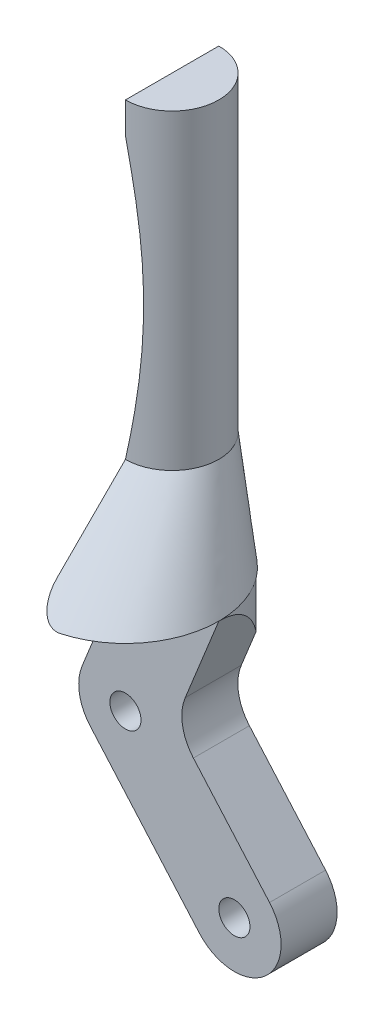
ISO-10303-21;
HEADER;
FILE_DESCRIPTION(('STEP AP214'),'2;1');
FILE_NAME('part.step','',(''),(''),'','','');
FILE_SCHEMA(('AUTOMOTIVE_DESIGN { 1 0 10303 214 1 1 1 1 }'));
ENDSEC;
DATA;
#1=APPLICATION_CONTEXT('core data for automotive mechanical design processes');
#2=APPLICATION_PROTOCOL_DEFINITION('international standard','automotive_design',2000,#1);
#3=PRODUCT_CONTEXT('',#1,'mechanical');
#4=PRODUCT('Part','Part','',(#3));
#5=PRODUCT_RELATED_PRODUCT_CATEGORY('part','',(#4));
#6=PRODUCT_DEFINITION_FORMATION('','',#4);
#7=PRODUCT_DEFINITION_CONTEXT('part definition',#1,'design');
#8=PRODUCT_DEFINITION('design','',#6,#7);
#9=PRODUCT_DEFINITION_SHAPE('','',#8);
#10=(LENGTH_UNIT() NAMED_UNIT(*) SI_UNIT(.MILLI.,.METRE.));
#11=(NAMED_UNIT(*) PLANE_ANGLE_UNIT() SI_UNIT($,.RADIAN.));
#12=(NAMED_UNIT(*) SI_UNIT($,.STERADIAN.) SOLID_ANGLE_UNIT());
#13=UNCERTAINTY_MEASURE_WITH_UNIT(LENGTH_MEASURE(1.E-05),#10,'distance_accuracy_value','');
#14=(GEOMETRIC_REPRESENTATION_CONTEXT(3) GLOBAL_UNCERTAINTY_ASSIGNED_CONTEXT((#13)) GLOBAL_UNIT_ASSIGNED_CONTEXT((#10,
#11,#12)) REPRESENTATION_CONTEXT('',''));
#15=CARTESIAN_POINT('',(0.,0.,0.));
#16=DIRECTION('',(0.,0.,1.));
#17=DIRECTION('',(1.,0.,0.));
#18=AXIS2_PLACEMENT_3D('',#15,#16,#17);
#19=CARTESIAN_POINT('',(0.,0.,0.));
#20=DIRECTION('',(-1.,0.,0.));
#21=DIRECTION('',(0.,0.,1.));
#22=AXIS2_PLACEMENT_3D('',#19,#20,#21);
#23=PLANE('',#22);
#24=DIRECTION('',(0.,0.,1.));
#25=VECTOR('',#24,1.);
#26=CARTESIAN_POINT('',(0.,3.,-3.05));
#27=LINE('',#26,#25);
#28=CARTESIAN_POINT('',(0.,3.,-3.));
#29=VERTEX_POINT('',#28);
#30=CARTESIAN_POINT('',(0.,3.,0.));
#31=VERTEX_POINT('',#30);
#32=EDGE_CURVE('E429',#29,#31,#27,.T.);
#33=ORIENTED_EDGE('',*,*,#32,.F.);
#34=DIRECTION('',(0.,1.,0.));
#35=VECTOR('',#34,1.);
#36=CARTESIAN_POINT('',(0.,1.5,-3.));
#37=LINE('',#36,#35);
#38=CARTESIAN_POINT('',(0.,0.8,-3.));
#39=VERTEX_POINT('',#38);
#40=EDGE_CURVE('E439',#39,#29,#37,.T.);
#41=ORIENTED_EDGE('',*,*,#40,.F.);
#42=DIRECTION('',(0.,0.,1.));
#43=VECTOR('',#42,1.);
#44=CARTESIAN_POINT('',(0.,0.8,-1.8));
#45=LINE('',#44,#43);
#46=CARTESIAN_POINT('',(0.,0.8,-1.8));
#47=VERTEX_POINT('',#46);
#48=EDGE_CURVE('E456',#39,#47,#45,.T.);
#49=ORIENTED_EDGE('',*,*,#48,.T.);
#50=DIRECTION('',(0.,-1.,0.));
#51=VECTOR('',#50,1.);
#52=CARTESIAN_POINT('',(0.,-8.,-1.8));
#53=LINE('',#52,#51);
#54=CARTESIAN_POINT('',(0.,0.,-1.8));
#55=VERTEX_POINT('',#54);
#56=EDGE_CURVE('E314',#47,#55,#53,.T.);
#57=ORIENTED_EDGE('',*,*,#56,.T.);
#58=DIRECTION('',(0.,0.,1.));
#59=VECTOR('',#58,1.);
#60=CARTESIAN_POINT('',(0.,0.,-1.8));
#61=LINE('',#60,#59);
#62=CARTESIAN_POINT('',(0.,0.,0.));
#63=VERTEX_POINT('',#62);
#64=EDGE_CURVE('E491',#55,#63,#61,.T.);
#65=ORIENTED_EDGE('',*,*,#64,.T.);
#66=DIRECTION('',(0.,1.,0.));
#67=VECTOR('',#66,1.);
#68=CARTESIAN_POINT('',(0.,0.,0.));
#69=LINE('',#68,#67);
#70=CARTESIAN_POINT('',(0.,0.8,0.));
#71=VERTEX_POINT('',#70);
#72=EDGE_CURVE('E208',#63,#71,#69,.T.);
#73=ORIENTED_EDGE('',*,*,#72,.T.);
#74=DIRECTION('',(0.,0.,1.));
#75=VECTOR('',#74,1.);
#76=CARTESIAN_POINT('',(0.,0.8,3.));
#77=LINE('',#76,#75);
#78=CARTESIAN_POINT('',(0.,0.8,2.2));
#79=VERTEX_POINT('',#78);
#80=EDGE_CURVE('E298',#71,#79,#77,.T.);
#81=ORIENTED_EDGE('',*,*,#80,.T.);
#82=DIRECTION('',(0.,-0.707106781186548,0.707106781186548));
#83=VECTOR('',#82,1.);
#84=CARTESIAN_POINT('',(0.,1.5,1.5));
#85=LINE('',#84,#83);
#86=EDGE_CURVE('E216',#31,#79,#85,.T.);
#87=ORIENTED_EDGE('',*,*,#86,.F.);
#88=EDGE_LOOP('',(#33,#41,#49,#57,#65,#73,#81,#87));
#89=FACE_BOUND('',#88,.T.);
#90=ADVANCED_FACE('F56',(#89),#23,.T.);
#91=CARTESIAN_POINT('',(0.,0.,0.));
#92=DIRECTION('',(0.,1.,0.));
#93=DIRECTION('',(0.,0.,1.));
#94=AXIS2_PLACEMENT_3D('',#91,#92,#93);
#95=PLANE('',#94);
#96=CARTESIAN_POINT('',(0.,0.,0.));
#97=DIRECTION('',(0.,1.,0.));
#98=DIRECTION('',(0.,0.,1.));
#99=AXIS2_PLACEMENT_3D('',#96,#97,#98);
#100=CIRCLE('',#99,3.);
#101=CARTESIAN_POINT('',(0.799941162053693,0.,2.89161869746494));
#102=VERTEX_POINT('',#101);
#103=CARTESIAN_POINT('',(3.00000001272587,0.,0.000285102787130018));
#104=VERTEX_POINT('',#103);
#105=EDGE_CURVE('E209',#102,#104,#100,.T.);
#106=ORIENTED_EDGE('',*,*,#105,.F.);
#107=DIRECTION('',(0.,0.,1.));
#108=VECTOR('',#107,1.);
#109=CARTESIAN_POINT('',(0.800000000000001,0.,0.));
#110=LINE('',#109,#108);
#111=CARTESIAN_POINT('',(0.800000000000001,0.,0.));
#112=VERTEX_POINT('',#111);
#113=EDGE_CURVE('E258',#102,#112,#110,.F.);
#114=ORIENTED_EDGE('',*,*,#113,.T.);
#115=DIRECTION('',(-1.,0.,0.));
#116=VECTOR('',#115,1.);
#117=CARTESIAN_POINT('',(0.,0.,0.));
#118=LINE('',#117,#116);
#119=EDGE_CURVE('E304',#104,#112,#118,.T.);
#120=ORIENTED_EDGE('',*,*,#119,.F.);
#121=EDGE_LOOP('',(#106,#114,#120));
#122=FACE_BOUND('',#121,.T.);
#123=ADVANCED_FACE('F238',(#122),#95,.F.);
#124=DIRECTION('',(-1.,0.,0.));
#125=VECTOR('',#124,1.);
#126=CARTESIAN_POINT('',(0.,0.,-1.8));
#127=LINE('',#126,#125);
#128=CARTESIAN_POINT('',(2.40048244343001,0.,-1.7999602399728));
#129=VERTEX_POINT('',#128);
#130=CARTESIAN_POINT('',(0.800000000000001,0.,-1.8));
#131=VERTEX_POINT('',#130);
#132=EDGE_CURVE('E201',#129,#131,#127,.T.);
#133=ORIENTED_EDGE('',*,*,#132,.T.);
#134=DIRECTION('',(0.,0.,1.));
#135=VECTOR('',#134,1.);
#136=CARTESIAN_POINT('',(0.800000000000001,0.,-3.));
#137=LINE('',#136,#135);
#138=CARTESIAN_POINT('',(0.799950070639176,0.,-2.89158213332256));
#139=VERTEX_POINT('',#138);
#140=EDGE_CURVE('E213',#131,#139,#137,.F.);
#141=ORIENTED_EDGE('',*,*,#140,.T.);
#142=EDGE_CURVE('E192',#129,#139,#100,.T.);
#143=ORIENTED_EDGE('',*,*,#142,.F.);
#144=EDGE_LOOP('',(#133,#141,#143));
#145=FACE_BOUND('',#144,.T.);
#146=ADVANCED_FACE('F212',(#145),#95,.F.);
#147=CARTESIAN_POINT('',(0.,3.,-3.));
#148=CARTESIAN_POINT('',(0.,0.,-3.));
#149=CARTESIAN_POINT('',(0.125000000000001,3.,-3.));
#150=CARTESIAN_POINT('',(0.25,0.,-3.));
#151=CARTESIAN_POINT('',(0.266400000000001,3.,-2.9848));
#152=CARTESIAN_POINT('',(0.5328,0.,-2.9696));
#153=CARTESIAN_POINT('',(0.573600000000001,3.,-2.8952));
#154=CARTESIAN_POINT('',(1.1472,0.,-2.7904));
#155=CARTESIAN_POINT('',(0.740000000000001,3.,-2.82));
#156=CARTESIAN_POINT('',(1.48,0.,-2.64));
#157=CARTESIAN_POINT('',(0.98,3.,-2.64));
#158=CARTESIAN_POINT('',(1.96,0.,-2.28));
#159=CARTESIAN_POINT('',(1.05820069204152,3.,-2.56837370242215));
#160=CARTESIAN_POINT('',(2.11615687746294,0.,-2.13773691124038));
#161=CARTESIAN_POINT('',(1.20228373702422,3.,-2.40321799307959));
#162=CARTESIAN_POINT('',(2.40439106774254,0.,-1.80746856821167));
#163=CARTESIAN_POINT('',(1.2681660899654,3.,-2.30968858131488));
#164=CARTESIAN_POINT('',(2.5363321799308,0.,-1.61937716262976));
#165=CARTESIAN_POINT('',(1.37889273356401,3.,-2.10207612456747));
#166=CARTESIAN_POINT('',(2.75778546712803,0.,-1.20415224913495));
#167=CARTESIAN_POINT('',(1.42301038062284,3.,-1.98810553633218));
#168=CARTESIAN_POINT('',(2.84710059171598,0.,-0.977041420118343));
#169=CARTESIAN_POINT('',(1.48356401384083,3.,-1.74956747404844));
#170=CARTESIAN_POINT('',(2.96828402366864,0.,-0.499881656804734));
#171=CARTESIAN_POINT('',(1.5,3.,-1.625));
#172=CARTESIAN_POINT('',(3.,0.,-0.25));
#173=CARTESIAN_POINT('',(1.5,3.,-1.375));
#174=CARTESIAN_POINT('',(3.,0.,0.25));
#175=CARTESIAN_POINT('',(1.48356401384083,3.,-1.25043252595156));
#176=CARTESIAN_POINT('',(2.96828402366864,0.,0.499881656804734));
#177=CARTESIAN_POINT('',(1.42301038062284,3.,-1.01189446366782));
#178=CARTESIAN_POINT('',(2.84710059171598,0.,0.977041420118343));
#179=CARTESIAN_POINT('',(1.37889273356401,3.,-0.897923875432526));
#180=CARTESIAN_POINT('',(2.75778546712803,0.,1.20415224913495));
#181=CARTESIAN_POINT('',(1.2681660899654,3.,-0.690311418685122));
#182=CARTESIAN_POINT('',(2.5363321799308,0.,1.61937716262976));
#183=CARTESIAN_POINT('',(1.20228373702422,3.,-0.596782006920416));
#184=CARTESIAN_POINT('',(2.40439106774254,0.,1.80746856821167));
#185=CARTESIAN_POINT('',(1.05820069204152,3.,-0.431626297577855));
#186=CARTESIAN_POINT('',(2.11615687746294,0.,2.13773691124038));
#187=CARTESIAN_POINT('',(0.98,3.,-0.36));
#188=CARTESIAN_POINT('',(1.96,0.,2.28));
#189=CARTESIAN_POINT('',(0.74,3.,-0.18));
#190=CARTESIAN_POINT('',(1.48,0.,2.64));
#191=CARTESIAN_POINT('',(0.5736,3.,-0.1048));
#192=CARTESIAN_POINT('',(1.1472,0.,2.7904));
#193=CARTESIAN_POINT('',(0.2664,3.,-0.0152));
#194=CARTESIAN_POINT('',(0.532800000000001,0.,2.9696));
#195=CARTESIAN_POINT('',(0.125,3.,0.));
#196=CARTESIAN_POINT('',(0.250000000000001,0.,3.));
#197=CARTESIAN_POINT('',(0.,3.,0.));
#198=CARTESIAN_POINT('',(0.,0.,3.));
#199=B_SPLINE_SURFACE_WITH_KNOTS('',3,1,((#147,#148),(#149,#150),(#151,#152),(#153,#154),(#155,
#156),(#157,#158),(#159,#160),(#161,#162),(#163,#164),(#165,#166),(#167,#168),(#169,#170),(#171,
#172),(#173,#174),(#175,#176),(#177,#178),(#179,#180),(#181,#182),(#183,#184),(#185,#186),(#187,
#188),(#189,#190),(#191,#192),(#193,#194),(#195,#196),(#197,#198)),.UNSPECIFIED.,.F.,.F.,.F.,(4,
2,2,2,2,2,2,2,2,2,2,2,4),(2,2),(0.,0.125,0.25,0.3125,0.375,0.4375,0.5,0.5625,0.625,0.6875,0.75,
0.875,1.),(0.,1.),.UNSPECIFIED.);
#200=CARTESIAN_POINT('',(0.799899449208257,6.31903862569061E-09,-2.8914006967202));
#201=CARTESIAN_POINT('',(0.778290543782172,2.72939302476757E-06,-2.89738633548667));
#202=CARTESIAN_POINT('',(0.756619291735745,0.000881692385905958,-2.90311400085013));
#203=CARTESIAN_POINT('',(0.71328593668985,0.00441603114416542,-2.91403877117005));
#204=CARTESIAN_POINT('',(0.691623834855664,0.00707158895938354,-2.91923582169085));
#205=CARTESIAN_POINT('',(0.626909821935553,0.0177303819022741,-2.93399571274288));
#206=CARTESIAN_POINT('',(0.584078427971745,0.0284256351566674,-2.9427415266401));
#207=CARTESIAN_POINT('',(0.500374662324426,0.0569089247975655,-2.95803775526223));
#208=CARTESIAN_POINT('',(0.459505295511572,0.0747074746789538,-2.96458488918095));
#209=CARTESIAN_POINT('',(0.381102255320823,0.1169874767193,-2.97564612094326));
#210=CARTESIAN_POINT('',(0.343566879008891,0.141465490822067,-2.98016126153636));
#211=CARTESIAN_POINT('',(0.273598231825945,0.19598308649262,-2.98741949038489));
#212=CARTESIAN_POINT('',(0.241090855442977,0.225924007503312,-2.99019064699332));
#213=CARTESIAN_POINT('',(0.18140906444992,0.290796914264643,-2.99446697551084));
#214=CARTESIAN_POINT('',(0.154234944265914,0.325729175381795,-2.99597207754159));
#215=CARTESIAN_POINT('',(0.105836389623697,0.399861725501803,-2.99813723850141));
#216=CARTESIAN_POINT('',(0.0846543501902845,0.439089829761398,-2.99879138834506));
#217=CARTESIAN_POINT('',(0.0490945464662506,0.520513649927747,-2.99962444703753));
#218=CARTESIAN_POINT('',(0.0347139883757389,0.562708139156818,-2.99980355115732));
#219=CARTESIAN_POINT('',(0.0159889591238483,0.63752402433261,-2.99996500536055));
#220=CARTESIAN_POINT('',(0.00999959808766427,0.669744144569083,-2.99998671694698));
#221=CARTESIAN_POINT('',(0.0020035608294374,0.734638811316102,-3.00000005115472));
#222=CARTESIAN_POINT('',(-7.46683931144943E-06,0.7673128219161,-2.99999170667917));
#223=CARTESIAN_POINT('',(0.,0.8,-3.));
#224=B_SPLINE_CURVE_WITH_KNOTS('',3,(#200,#201,#202,#203,#204,#205,#206,#207,#208,#209,#210,
#211,#212,#213,#214,#215,#216,#217,#218,#219,#220,#221,#222,#223),.UNSPECIFIED.,.F.,.F.,(4,2,2,
2,2,2,2,2,2,2,2,4),(0.,0.0672306314864284,0.134468153233146,0.268784112914492,0.403299613541426,
0.537746006480378,0.669969167982408,0.802199626903192,0.935343488556404,1.0684326119782,
1.16651456587891,1.26448917963123),.UNSPECIFIED.);
#225=EDGE_CURVE('E464',#139,#39,#224,.T.);
#226=CARTESIAN_POINT('',(0.,3.,-1.5));
#227=DIRECTION('',(0.,1.,0.));
#228=DIRECTION('',(0.,0.,1.));
#229=AXIS2_PLACEMENT_3D('',#226,#227,#228);
#230=CIRCLE('',#229,1.5);
#231=EDGE_CURVE('E398',#31,#29,#230,.T.);
#232=CARTESIAN_POINT('',(0.,0.8,2.2));
#233=CARTESIAN_POINT('',(1.02740845783526E-05,0.769543295953525,2.23044970161117));
#234=CARTESIAN_POINT('',(0.00173991550751647,0.739089010566679,2.26091077714929));
#235=CARTESIAN_POINT('',(0.00871313724903406,0.678317119349842,2.32167304775507));
#236=CARTESIAN_POINT('',(0.0139629460803654,0.647999851847276,2.351973863314));
#237=CARTESIAN_POINT('',(0.0281342523845236,0.587392182356891,2.41247368120028));
#238=CARTESIAN_POINT('',(0.0370978179212061,0.557106209205035,2.44266738367004));
#239=CARTESIAN_POINT('',(0.0588483936432668,0.497162903173394,2.50224234879365));
#240=CARTESIAN_POINT('',(0.0716320998032389,0.467505050675901,2.53162428964354));
#241=CARTESIAN_POINT('',(0.104747028165427,0.402177568298246,2.59595744877867));
#242=CARTESIAN_POINT('',(0.126145390291379,0.366730224561971,2.63059774136665));
#243=CARTESIAN_POINT('',(0.175715070597487,0.297944295215759,2.69682379819694));
#244=CARTESIAN_POINT('',(0.20386255321887,0.264598798652741,2.72841977534379));
#245=CARTESIAN_POINT('',(0.2591367542081,0.209621738197292,2.7789867084984));
#246=CARTESIAN_POINT('',(0.284493044188702,0.187255676947156,2.79906492095372));
#247=CARTESIAN_POINT('',(0.32569746222656,0.155533589253908,2.82646244672552));
#248=CARTESIAN_POINT('',(0.33995243962797,0.145268879458301,2.83513788606716));
#249=CARTESIAN_POINT('',(0.369546126421515,0.125442891016206,2.85143805251969));
#250=CARTESIAN_POINT('',(0.384886118027081,0.1158824728377,2.85906150397349));
#251=CARTESIAN_POINT('',(0.425354276642777,0.0925787522827368,2.87692141549655));
#252=CARTESIAN_POINT('',(0.451226029525883,0.0794264995972343,2.88628929216727));
#253=CARTESIAN_POINT('',(0.5051301998358,0.055744942658871,2.90130822410522));
#254=CARTESIAN_POINT('',(0.533158920385018,0.0452112759259282,2.90696548725685));
#255=CARTESIAN_POINT('',(0.59093806353908,0.0272035868749249,2.91401879965685));
#256=CARTESIAN_POINT('',(0.620699267463427,0.0197517467353568,2.9153844069168));
#257=CARTESIAN_POINT('',(0.680741411665201,0.00835056737593171,2.91350892826329));
#258=CARTESIAN_POINT('',(0.711021942790196,0.0043985893334721,2.91027131788659));
#259=CARTESIAN_POINT('',(0.750896323864027,0.00144572623280449,2.90308198153693));
#260=CARTESIAN_POINT('',(0.760772933388067,0.000901383448208704,2.90105810719355));
#261=CARTESIAN_POINT('',(0.780411903156185,0.000179988248179906,2.89656243859579));
#262=CARTESIAN_POINT('',(0.790174484205572,2.03824769803593E-06,2.89409175513795));
#263=CARTESIAN_POINT('',(0.79988196725486,8.7073301902052E-09,2.89140552957365));
#264=B_SPLINE_CURVE_WITH_KNOTS('',3,(#232,#233,#234,#235,#236,#237,#238,#239,#240,#241,#242,
#243,#244,#245,#246,#247,#248,#249,#250,#251,#252,#253,#254,#255,#256,#257,#258,#259,#260,#261,
#262,#263),.UNSPECIFIED.,.F.,.F.,(4,2,2,2,2,2,2,2,2,2,2,2,2,2,2,4),(0.,0.129177382362395,
0.258583933814457,0.389498268775044,0.520299702523116,0.681793194514169,0.842724536826961,
0.960271627979336,1.01898470632599,1.0777683669247,1.168879416185,1.25983764451592,
1.35143962696328,1.44297248449127,1.4732502694468,1.50345379153248),.UNSPECIFIED.);
#265=EDGE_CURVE('E257',#79,#102,#264,.T.);
#266=CARTESIAN_POINT('',(2.99981658396651,0.,-0.0466108057369085));
#267=VERTEX_POINT('',#266);
#268=EDGE_CURVE('E61',#104,#267,#100,.T.);
#269=CARTESIAN_POINT('',(0.,0.,0.));
#270=DIRECTION('',(0.,-1.,0.));
#271=DIRECTION('',(0.,0.,-1.));
#272=AXIS2_PLACEMENT_3D('',#269,#270,#271);
#273=CIRCLE('',#272,3.00036211592845);
#274=EDGE_CURVE('E179',#129,#267,#273,.T.);
#275=ORIENTED_EDGE('',*,*,#142,.T.);
#276=ORIENTED_EDGE('',*,*,#225,.T.);
#277=ORIENTED_EDGE('',*,*,#40,.T.);
#278=ORIENTED_EDGE('',*,*,#231,.F.);
#279=ORIENTED_EDGE('',*,*,#86,.T.);
#280=ORIENTED_EDGE('',*,*,#265,.T.);
#281=ORIENTED_EDGE('',*,*,#105,.T.);
#282=ORIENTED_EDGE('',*,*,#268,.T.);
#283=ORIENTED_EDGE('',*,*,#274,.F.);
#284=EDGE_LOOP('',(#275,#276,#277,#278,#279,#280,#281,#282,#283));
#285=FACE_BOUND('',#284,.T.);
#286=ADVANCED_FACE('F190',(#285),#199,.T.);
#287=DIRECTION('',(0.,-1.,0.));
#288=VECTOR('',#287,1.);
#289=CARTESIAN_POINT('',(0.,13.,-3.));
#290=LINE('',#289,#288);
#291=CARTESIAN_POINT('',(0.,13.,-3.));
#292=VERTEX_POINT('',#291);
#293=CARTESIAN_POINT('',(0.,12.0552167895721,-3.));
#294=VERTEX_POINT('',#293);
#295=EDGE_CURVE('E433',#292,#294,#290,.T.);
#296=ORIENTED_EDGE('',*,*,#295,.T.);
#297=DIRECTION('',(0.,0.,-1.));
#298=VECTOR('',#297,1.);
#299=CARTESIAN_POINT('',(0.,12.0552167895721,0.));
#300=LINE('',#299,#298);
#301=CARTESIAN_POINT('',(0.,12.0552167895721,0.));
#302=VERTEX_POINT('',#301);
#303=EDGE_CURVE('E404',#294,#302,#300,.F.);
#304=ORIENTED_EDGE('',*,*,#303,.T.);
#305=DIRECTION('',(0.,-1.,0.));
#306=VECTOR('',#305,1.);
#307=CARTESIAN_POINT('',(0.,13.,0.));
#308=LINE('',#307,#306);
#309=CARTESIAN_POINT('',(0.,13.,0.));
#310=VERTEX_POINT('',#309);
#311=EDGE_CURVE('E424',#310,#302,#308,.T.);
#312=ORIENTED_EDGE('',*,*,#311,.F.);
#313=DIRECTION('',(0.,0.,1.));
#314=VECTOR('',#313,1.);
#315=CARTESIAN_POINT('',(0.,13.,-3.));
#316=LINE('',#315,#314);
#317=EDGE_CURVE('E435',#292,#310,#316,.T.);
#318=ORIENTED_EDGE('',*,*,#317,.F.);
#319=EDGE_LOOP('',(#296,#304,#312,#318));
#320=FACE_BOUND('',#319,.T.);
#321=ADVANCED_FACE('F239',(#320),#23,.T.);
#322=CARTESIAN_POINT('',(0.,13.,-1.5));
#323=DIRECTION('',(0.,-1.,0.));
#324=DIRECTION('',(0.,0.,-1.));
#325=AXIS2_PLACEMENT_3D('',#322,#323,#324);
#326=CYLINDRICAL_SURFACE('',#325,1.5);
#327=ORIENTED_EDGE('',*,*,#311,.T.);
#328=CARTESIAN_POINT('',(0.,12.0552167895721,0.));
#329=CARTESIAN_POINT('',(5.94120379517222E-06,12.0369233921626,5.89345626916526E-06));
#330=CARTESIAN_POINT('',(0.0010009753206934,12.0187385648037,4.90336239505667E-06));
#331=CARTESIAN_POINT('',(0.00496922933475355,11.9825860506058,-1.08439254573881E-05));
#332=CARTESIAN_POINT('',(0.0079424491861091,11.9646183637617,-2.56011191169368E-05));
#333=CARTESIAN_POINT('',(0.0119047619047621,11.9467592469633,-4.72418626009718E-05));
#334=B_SPLINE_CURVE_WITH_KNOTS('',3,(#328,#329,#330,#331,#332,#333),.UNSPECIFIED.,.F.,.F.,(4,2,
4),(0.,0.0546360902656623,0.109272179266185),.UNSPECIFIED.);
#335=CARTESIAN_POINT('',(0.0119047619047601,11.9467592469633,-4.72418626011456E-05));
#336=VERTEX_POINT('',#335);
#337=EDGE_CURVE('E68',#302,#336,#334,.T.);
#338=ORIENTED_EDGE('',*,*,#337,.T.);
#339=CARTESIAN_POINT('',(0.,12.,0.));
#340=CARTESIAN_POINT('',(0.027666334140701,11.8770388730742,-4.98469094672548E-06));
#341=CARTESIAN_POINT('',(0.054197106490066,11.7538289220012,-0.000764785710620818));
#342=CARTESIAN_POINT('',(0.10497858789328,11.5069584222973,-0.00346100750093992));
#343=CARTESIAN_POINT('',(0.129229404858736,11.3832978952803,-0.00539737255172226));
#344=CARTESIAN_POINT('',(0.198541387022119,11.01175192608,-0.0124708612310734));
#345=CARTESIAN_POINT('',(0.240175136375947,10.7632440752353,-0.0188726948352821));
#346=CARTESIAN_POINT('',(0.313941232970407,10.2669839322523,-0.0327455151546636));
#347=CARTESIAN_POINT('',(0.346149959430406,10.0192426367203,-0.0402071353915021));
#348=CARTESIAN_POINT('',(0.401497590204371,9.52269738608262,-0.0544489707013256));
#349=CARTESIAN_POINT('',(0.424635470128446,9.27389331416092,-0.0612291087488279));
#350=CARTESIAN_POINT('',(0.461847083668592,8.77496626314019,-0.0727372747881561));
#351=CARTESIAN_POINT('',(0.475899257544585,8.52484155654178,-0.0774604130666541));
#352=CARTESIAN_POINT('',(0.49482813632622,8.02418937186541,-0.0839328278400341));
#353=CARTESIAN_POINT('',(0.49970430028105,7.77366187091294,-0.0856819290067304));
#354=CARTESIAN_POINT('',(0.500269741397223,7.27247483915336,-0.0858817687120252));
#355=CARTESIAN_POINT('',(0.495954610601212,7.02181530265957,-0.0843309246646202));
#356=CARTESIAN_POINT('',(0.478137388624626,6.52086358002817,-0.0782151501250639));
#357=CARTESIAN_POINT('',(0.464635334756548,6.2705713924027,-0.0736502318745143));
#358=CARTESIAN_POINT('',(0.428167405620937,5.76654125769458,-0.0622786555307081));
#359=CARTESIAN_POINT('',(0.405047782090017,5.51281528127532,-0.055435956812336));
#360=CARTESIAN_POINT('',(0.349373083615271,5.00642809722952,-0.0409715840742026));
#361=CARTESIAN_POINT('',(0.316818041071708,4.7537668859497,-0.0333499127294118));
#362=CARTESIAN_POINT('',(0.242327285958368,4.24992338516089,-0.0192178994452075));
#363=CARTESIAN_POINT('',(0.200396477075201,3.99874039274532,-0.012706979690585));
#364=CARTESIAN_POINT('',(0.130494259404503,3.62322088873921,-0.00550420658990818));
#365=CARTESIAN_POINT('',(0.106024285477838,3.4982499181395,-0.00353051122903898));
#366=CARTESIAN_POINT('',(0.0547561578638298,3.24876794315602,-0.000780978796902989));
#367=CARTESIAN_POINT('',(0.0279579000106757,3.12425695961182,-5.1953485654577E-06));
#368=CARTESIAN_POINT('',(0.,2.99999999999998,5.60786410968256E-13));
#369=B_SPLINE_CURVE_WITH_KNOTS('',3,(#339,#340,#341,#342,#343,#344,#345,#346,#347,#348,#349,
#350,#351,#352,#353,#354,#355,#356,#357,#358,#359,#360,#361,#362,#363,#364,#365,#366,#367,#368),
.UNSPECIFIED.,.F.,.F.,(4,2,2,2,2,2,2,2,2,2,2,2,2,2,4),(0.,0.378087005404732,0.75615610671444,
1.5121160246249,2.26176837100983,3.01150535284957,3.7630149411203,4.51456883154322,
5.26648323302119,6.01839458063273,6.78281847156172,7.54723973756833,8.3112621294468,
8.69331613918042,9.07538725055657),.UNSPECIFIED.);
#370=EDGE_CURVE('E401',#336,#31,#369,.T.);
#371=ORIENTED_EDGE('',*,*,#370,.T.);
#372=ORIENTED_EDGE('',*,*,#231,.T.);
#373=CARTESIAN_POINT('',(0.,2.99999999999999,-3.));
#374=CARTESIAN_POINT('',(0.0276663341407041,3.12296112692583,-2.99999501530905));
#375=CARTESIAN_POINT('',(0.054197106490069,3.24617107799878,-2.99923521428938));
#376=CARTESIAN_POINT('',(0.104978587893281,3.49304157770274,-2.99653899249906));
#377=CARTESIAN_POINT('',(0.129229404858734,3.61670210471967,-2.99460262744828));
#378=CARTESIAN_POINT('',(0.198541387022114,3.98824807391997,-2.98752913876893));
#379=CARTESIAN_POINT('',(0.240175136375943,4.23675592476469,-2.98112730516472));
#380=CARTESIAN_POINT('',(0.313941232970405,4.7330160677477,-2.96725448484534));
#381=CARTESIAN_POINT('',(0.346149959430404,4.98075736327972,-2.9597928646085));
#382=CARTESIAN_POINT('',(0.40149759020437,5.47730261391737,-2.94555102929867));
#383=CARTESIAN_POINT('',(0.424635470128446,5.72610668583907,-2.93877089125117));
#384=CARTESIAN_POINT('',(0.461847083668593,6.2250337368598,-2.92726272521184));
#385=CARTESIAN_POINT('',(0.475899257544586,6.47515844345822,-2.92253958693335));
#386=CARTESIAN_POINT('',(0.494828136326222,6.97581062813459,-2.91606717215997));
#387=CARTESIAN_POINT('',(0.499704300281052,7.22633812908705,-2.91431807099327));
#388=CARTESIAN_POINT('',(0.500269741397224,7.72752516084663,-2.91411823128797));
#389=CARTESIAN_POINT('',(0.495954610601212,7.97818469734042,-2.91566907533538));
#390=CARTESIAN_POINT('',(0.478137388624625,8.47913641997183,-2.92178484987494));
#391=CARTESIAN_POINT('',(0.464635334756546,8.72942860759729,-2.92634976812549));
#392=CARTESIAN_POINT('',(0.428167405620936,9.23345874230542,-2.93772134446929));
#393=CARTESIAN_POINT('',(0.40504778209002,9.48718471872468,-2.94456404318766));
#394=CARTESIAN_POINT('',(0.349373083615273,9.99357190277048,-2.9590284159258));
#395=CARTESIAN_POINT('',(0.316818041071707,10.2462331140503,-2.96665008727059));
#396=CARTESIAN_POINT('',(0.242327285958367,10.7500766148391,-2.98078210055479));
#397=CARTESIAN_POINT('',(0.200396477075203,11.0012596072547,-2.98729302030941));
#398=CARTESIAN_POINT('',(0.130494259404503,11.3767791112608,-2.99449579341009));
#399=CARTESIAN_POINT('',(0.106024285477836,11.5017500818605,-2.99646948877096));
#400=CARTESIAN_POINT('',(0.0547561578638254,11.751232056844,-2.9992190212031));
#401=CARTESIAN_POINT('',(0.0279579000106698,11.8757430403882,-2.99999480465143));
#402=CARTESIAN_POINT('',(0.,12.,-3.00000000000056));
#403=B_SPLINE_CURVE_WITH_KNOTS('',3,(#373,#374,#375,#376,#377,#378,#379,#380,#381,#382,#383,
#384,#385,#386,#387,#388,#389,#390,#391,#392,#393,#394,#395,#396,#397,#398,#399,#400,#401,#402),
.UNSPECIFIED.,.F.,.F.,(4,2,2,2,2,2,2,2,2,2,2,2,2,2,4),(0.,0.378087005404731,0.756156106714439,
1.5121160246249,2.26176837100983,3.01150535284957,3.7630149411203,4.51456883154323,
5.26648323302119,6.01839458063274,6.78281847156173,7.54723973756834,8.31126212944681,
8.69331613918044,9.07538725055658),.UNSPECIFIED.);
#404=CARTESIAN_POINT('',(0.0119047619047632,11.9467592469633,-2.9999527581374));
#405=VERTEX_POINT('',#404);
#406=EDGE_CURVE('E405',#29,#405,#403,.T.);
#407=ORIENTED_EDGE('',*,*,#406,.T.);
#408=CARTESIAN_POINT('',(0.0119047619047627,11.9467592469633,-2.9999527581374));
#409=CARTESIAN_POINT('',(0.00794244918610949,11.9646183637617,-2.99997439888088));
#410=CARTESIAN_POINT('',(0.00496922933475374,11.9825860506058,-2.99998915607454));
#411=CARTESIAN_POINT('',(0.00100097532069327,12.0187385648037,-3.00000490336239));
#412=CARTESIAN_POINT('',(5.94120379492565E-06,12.0369233921626,-3.00000589345627));
#413=CARTESIAN_POINT('',(0.,12.0552167895721,-3.));
#414=B_SPLINE_CURVE_WITH_KNOTS('',3,(#408,#409,#410,#411,#412,#413),.UNSPECIFIED.,.F.,.F.,(4,2,
4),(0.,0.0546360890005228,0.109272179266185),.UNSPECIFIED.);
#415=EDGE_CURVE('E406',#405,#294,#414,.T.);
#416=ORIENTED_EDGE('',*,*,#415,.T.);
#417=ORIENTED_EDGE('',*,*,#295,.F.);
#418=CARTESIAN_POINT('',(0.,13.,-1.5));
#419=DIRECTION('',(0.,1.,0.));
#420=DIRECTION('',(0.,0.,1.));
#421=AXIS2_PLACEMENT_3D('',#418,#419,#420);
#422=CIRCLE('',#421,1.5);
#423=EDGE_CURVE('E518',#310,#292,#422,.T.);
#424=ORIENTED_EDGE('',*,*,#423,.F.);
#425=EDGE_LOOP('',(#327,#338,#371,#372,#407,#416,#417,#424));
#426=FACE_BOUND('',#425,.T.);
#427=ADVANCED_FACE('F265',(#426),#326,.T.);
#428=CARTESIAN_POINT('',(0.,13.,-1.5));
#429=DIRECTION('',(0.,1.,0.));
#430=DIRECTION('',(0.,0.,1.));
#431=AXIS2_PLACEMENT_3D('',#428,#429,#430);
#432=PLANE('',#431);
#433=ORIENTED_EDGE('',*,*,#423,.T.);
#434=ORIENTED_EDGE('',*,*,#317,.T.);
#435=EDGE_LOOP('',(#433,#434));
#436=FACE_BOUND('',#435,.T.);
#437=ADVANCED_FACE('F628',(#436),#432,.T.);
#438=CARTESIAN_POINT('',(3.5,-8.,-1.8));
#439=DIRECTION('',(0.,0.,1.));
#440=DIRECTION('',(1.,0.,0.));
#441=AXIS2_PLACEMENT_3D('',#438,#439,#440);
#442=CYLINDRICAL_SURFACE('',#441,1.5);
#443=CARTESIAN_POINT('',(3.5,-8.,0.));
#444=DIRECTION('',(0.,0.,1.));
#445=DIRECTION('',(1.,0.,0.));
#446=AXIS2_PLACEMENT_3D('',#443,#444,#445);
#447=CIRCLE('',#446,1.5);
#448=CARTESIAN_POINT('',(2.37113495793968,-8.98775691180278,0.));
#449=VERTEX_POINT('',#448);
#450=CARTESIAN_POINT('',(4.62886504206032,-7.01224308819722,0.));
#451=VERTEX_POINT('',#450);
#452=EDGE_CURVE('E485',#449,#451,#447,.T.);
#453=ORIENTED_EDGE('',*,*,#452,.F.);
#454=DIRECTION('',(0.,0.,1.));
#455=VECTOR('',#454,1.);
#456=CARTESIAN_POINT('',(2.37113495793968,-8.98775691180278,-1.8));
#457=LINE('',#456,#455);
#458=CARTESIAN_POINT('',(2.37113495793968,-8.98775691180278,-1.8));
#459=VERTEX_POINT('',#458);
#460=EDGE_CURVE('E530',#459,#449,#457,.T.);
#461=ORIENTED_EDGE('',*,*,#460,.F.);
#462=CARTESIAN_POINT('',(3.5,-8.,-1.8));
#463=DIRECTION('',(0.,0.,1.));
#464=DIRECTION('',(1.,0.,0.));
#465=AXIS2_PLACEMENT_3D('',#462,#463,#464);
#466=CIRCLE('',#465,1.5);
#467=CARTESIAN_POINT('',(4.62886504206032,-7.01224308819722,-1.8));
#468=VERTEX_POINT('',#467);
#469=EDGE_CURVE('E525',#459,#468,#466,.T.);
#470=ORIENTED_EDGE('',*,*,#469,.T.);
#471=DIRECTION('',(0.,0.,1.));
#472=VECTOR('',#471,1.);
#473=CARTESIAN_POINT('',(4.62886504206032,-7.01224308819722,-1.8));
#474=LINE('',#473,#472);
#475=EDGE_CURVE('E576',#468,#451,#474,.T.);
#476=ORIENTED_EDGE('',*,*,#475,.T.);
#477=EDGE_LOOP('',(#453,#461,#470,#476));
#478=FACE_BOUND('',#477,.T.);
#479=ADVANCED_FACE('F610',(#478),#442,.T.);
#480=CARTESIAN_POINT('',(2.37113495793968,-8.98775691180278,-1.8));
#481=DIRECTION('',(-0.752576694706878,-0.658504607868518,0.));
#482=DIRECTION('',(0.658504607868518,-0.752576694706878,0.));
#483=AXIS2_PLACEMENT_3D('',#480,#481,#482);
#484=PLANE('',#483);
#485=DIRECTION('',(0.658504607868518,-0.752576694706878,0.));
#486=VECTOR('',#485,1.);
#487=CARTESIAN_POINT('',(2.37113495793968,-8.98775691180278,0.));
#488=LINE('',#487,#486);
#489=CARTESIAN_POINT('',(-1.12886504206032,-4.98775691180278,0.));
#490=VERTEX_POINT('',#489);
#491=EDGE_CURVE('E528',#490,#449,#488,.T.);
#492=ORIENTED_EDGE('',*,*,#491,.F.);
#493=DIRECTION('',(0.,0.,1.));
#494=VECTOR('',#493,1.);
#495=CARTESIAN_POINT('',(-1.12886504206032,-4.98775691180278,-1.8));
#496=LINE('',#495,#494);
#497=CARTESIAN_POINT('',(-1.12886504206032,-4.98775691180278,-1.8));
#498=VERTEX_POINT('',#497);
#499=EDGE_CURVE('E533',#498,#490,#496,.T.);
#500=ORIENTED_EDGE('',*,*,#499,.F.);
#501=DIRECTION('',(0.658504607868518,-0.752576694706878,0.));
#502=VECTOR('',#501,1.);
#503=CARTESIAN_POINT('',(2.37113495793968,-8.98775691180278,-1.8));
#504=LINE('',#503,#502);
#505=EDGE_CURVE('E508',#498,#459,#504,.T.);
#506=ORIENTED_EDGE('',*,*,#505,.T.);
#507=ORIENTED_EDGE('',*,*,#460,.T.);
#508=EDGE_LOOP('',(#492,#500,#506,#507));
#509=FACE_BOUND('',#508,.T.);
#510=ADVANCED_FACE('F606',(#509),#484,.T.);
#511=CARTESIAN_POINT('',(0.,-4.,-1.8));
#512=DIRECTION('',(0.,0.,1.));
#513=DIRECTION('',(1.,0.,0.));
#514=AXIS2_PLACEMENT_3D('',#511,#512,#513);
#515=CYLINDRICAL_SURFACE('',#514,1.5);
#516=CARTESIAN_POINT('',(0.,-4.,0.));
#517=DIRECTION('',(0.,0.,1.));
#518=DIRECTION('',(1.,0.,0.));
#519=AXIS2_PLACEMENT_3D('',#516,#517,#518);
#520=CIRCLE('',#519,1.5);
#521=CARTESIAN_POINT('',(-1.39053721633044,-3.4375,0.));
#522=VERTEX_POINT('',#521);
#523=EDGE_CURVE('E559',#522,#490,#520,.T.);
#524=ORIENTED_EDGE('',*,*,#523,.F.);
#525=DIRECTION('',(0.,0.,1.));
#526=VECTOR('',#525,1.);
#527=CARTESIAN_POINT('',(-1.39053721633044,-3.4375,-1.8));
#528=LINE('',#527,#526);
#529=CARTESIAN_POINT('',(-1.39053721633044,-3.4375,-1.8));
#530=VERTEX_POINT('',#529);
#531=EDGE_CURVE('E477',#530,#522,#528,.T.);
#532=ORIENTED_EDGE('',*,*,#531,.F.);
#533=CARTESIAN_POINT('',(0.,-4.,-1.8));
#534=DIRECTION('',(0.,0.,1.));
#535=DIRECTION('',(1.,0.,0.));
#536=AXIS2_PLACEMENT_3D('',#533,#534,#535);
#537=CIRCLE('',#536,1.5);
#538=EDGE_CURVE('E506',#530,#498,#537,.T.);
#539=ORIENTED_EDGE('',*,*,#538,.T.);
#540=ORIENTED_EDGE('',*,*,#499,.T.);
#541=EDGE_LOOP('',(#524,#532,#539,#540));
#542=FACE_BOUND('',#541,.T.);
#543=ADVANCED_FACE('F348',(#542),#515,.T.);
#544=CARTESIAN_POINT('',(0.,0.,-1.8));
#545=DIRECTION('',(-0.927024810886958,0.375,0.));
#546=DIRECTION('',(-0.375,-0.927024810886958,0.));
#547=AXIS2_PLACEMENT_3D('',#544,#545,#546);
#548=PLANE('',#547);
#549=DIRECTION('',(-0.375,-0.927024810886958,0.));
#550=VECTOR('',#549,1.);
#551=CARTESIAN_POINT('',(0.,0.,0.));
#552=LINE('',#551,#550);
#553=EDGE_CURVE('E499',#63,#522,#552,.T.);
#554=ORIENTED_EDGE('',*,*,#553,.F.);
#555=ORIENTED_EDGE('',*,*,#64,.F.);
#556=DIRECTION('',(-0.375,-0.927024810886958,0.));
#557=VECTOR('',#556,1.);
#558=CARTESIAN_POINT('',(0.,0.,-1.8));
#559=LINE('',#558,#557);
#560=EDGE_CURVE('E509',#55,#530,#559,.T.);
#561=ORIENTED_EDGE('',*,*,#560,.T.);
#562=ORIENTED_EDGE('',*,*,#531,.T.);
#563=EDGE_LOOP('',(#554,#555,#561,#562));
#564=FACE_BOUND('',#563,.T.);
#565=ADVANCED_FACE('F337',(#564),#548,.T.);
#566=CARTESIAN_POINT('',(3.,0.,-1.8));
#567=DIRECTION('',(0.927024810886958,-0.375,0.));
#568=DIRECTION('',(0.375,0.927024810886958,0.));
#569=AXIS2_PLACEMENT_3D('',#566,#567,#568);
#570=PLANE('',#569);
#571=CARTESIAN_POINT('',(0.,-7.41619848709566,0.));
#572=DIRECTION('',(0.927024810886958,-0.375,0.));
#573=DIRECTION('',(0.375,0.927024810886958,0.));
#574=AXIS2_PLACEMENT_3D('',#571,#572,#573);
#575=ELLIPSE('',#574,8.00096564247586,3.00036211592845);
#576=CARTESIAN_POINT('',(2.4004526295469,-1.48212076723215,-1.8));
#577=VERTEX_POINT('',#576);
#578=EDGE_CURVE('E76',#267,#577,#575,.F.);
#579=ORIENTED_EDGE('',*,*,#578,.F.);
#580=ORIENTED_EDGE('',*,*,#268,.F.);
#581=DIRECTION('',(0.375,0.927024810886958,0.));
#582=VECTOR('',#581,1.);
#583=CARTESIAN_POINT('',(3.,0.,0.));
#584=LINE('',#583,#582);
#585=CARTESIAN_POINT('',(1.92128277351179,-2.66666035436197,0.));
#586=VERTEX_POINT('',#585);
#587=EDGE_CURVE('E500',#586,#104,#584,.T.);
#588=ORIENTED_EDGE('',*,*,#587,.F.);
#589=DIRECTION('',(0.,0.,1.));
#590=VECTOR('',#589,1.);
#591=CARTESIAN_POINT('',(1.92128277351179,-2.66666035436197,-1.8));
#592=LINE('',#591,#590);
#593=CARTESIAN_POINT('',(1.92128277351179,-2.66666035436197,-1.8));
#594=VERTEX_POINT('',#593);
#595=EDGE_CURVE('E492',#594,#586,#592,.T.);
#596=ORIENTED_EDGE('',*,*,#595,.F.);
#597=DIRECTION('',(0.375,0.927024810886958,0.));
#598=VECTOR('',#597,1.);
#599=CARTESIAN_POINT('',(3.,0.,-1.8));
#600=LINE('',#599,#598);
#601=EDGE_CURVE('E482',#594,#577,#600,.T.);
#602=ORIENTED_EDGE('',*,*,#601,.T.);
#603=EDGE_LOOP('',(#579,#580,#588,#596,#602));
#604=FACE_BOUND('',#603,.T.);
#605=ADVANCED_FACE('F347',(#604),#570,.T.);
#606=CARTESIAN_POINT('',(3.31181998984222,-3.22916035436197,-1.8));
#607=DIRECTION('',(0.,0.,1.));
#608=DIRECTION('',(1.,0.,0.));
#609=AXIS2_PLACEMENT_3D('',#606,#607,#608);
#610=CYLINDRICAL_SURFACE('',#609,1.5);
#611=CARTESIAN_POINT('',(3.31181998984222,-3.22916035436197,0.));
#612=DIRECTION('',(0.,0.,-1.));
#613=DIRECTION('',(-1.,0.,0.));
#614=AXIS2_PLACEMENT_3D('',#611,#612,#613);
#615=CIRCLE('',#614,1.5);
#616=CARTESIAN_POINT('',(2.18295494778191,-4.21691726616476,0.));
#617=VERTEX_POINT('',#616);
#618=EDGE_CURVE('E512',#617,#586,#615,.T.);
#619=ORIENTED_EDGE('',*,*,#618,.F.);
#620=DIRECTION('',(0.,0.,1.));
#621=VECTOR('',#620,1.);
#622=CARTESIAN_POINT('',(2.18295494778191,-4.21691726616476,-1.8));
#623=LINE('',#622,#621);
#624=CARTESIAN_POINT('',(2.18295494778191,-4.21691726616476,-1.8));
#625=VERTEX_POINT('',#624);
#626=EDGE_CURVE('E504',#625,#617,#623,.T.);
#627=ORIENTED_EDGE('',*,*,#626,.F.);
#628=CARTESIAN_POINT('',(3.31181998984222,-3.22916035436197,-1.8));
#629=DIRECTION('',(0.,0.,-1.));
#630=DIRECTION('',(-1.,0.,0.));
#631=AXIS2_PLACEMENT_3D('',#628,#629,#630);
#632=CIRCLE('',#631,1.5);
#633=EDGE_CURVE('E479',#625,#594,#632,.T.);
#634=ORIENTED_EDGE('',*,*,#633,.T.);
#635=ORIENTED_EDGE('',*,*,#595,.T.);
#636=EDGE_LOOP('',(#619,#627,#634,#635));
#637=FACE_BOUND('',#636,.T.);
#638=ADVANCED_FACE('F354',(#637),#610,.F.);
#639=CARTESIAN_POINT('',(4.62886504206032,-7.01224308819722,-1.8));
#640=DIRECTION('',(0.752576694706877,0.658504607868518,0.));
#641=DIRECTION('',(-0.658504607868518,0.752576694706878,0.));
#642=AXIS2_PLACEMENT_3D('',#639,#640,#641);
#643=PLANE('',#642);
#644=DIRECTION('',(-0.658504607868518,0.752576694706877,0.));
#645=VECTOR('',#644,1.);
#646=CARTESIAN_POINT('',(4.62886504206032,-7.01224308819722,0.));
#647=LINE('',#646,#645);
#648=EDGE_CURVE('E487',#451,#617,#647,.T.);
#649=ORIENTED_EDGE('',*,*,#648,.F.);
#650=ORIENTED_EDGE('',*,*,#475,.F.);
#651=DIRECTION('',(-0.658504607868518,0.752576694706877,0.));
#652=VECTOR('',#651,1.);
#653=CARTESIAN_POINT('',(4.62886504206032,-7.01224308819722,-1.8));
#654=LINE('',#653,#652);
#655=EDGE_CURVE('E483',#468,#625,#654,.T.);
#656=ORIENTED_EDGE('',*,*,#655,.T.);
#657=ORIENTED_EDGE('',*,*,#626,.T.);
#658=EDGE_LOOP('',(#649,#650,#656,#657));
#659=FACE_BOUND('',#658,.T.);
#660=ADVANCED_FACE('F611',(#659),#643,.T.);
#661=CARTESIAN_POINT('',(3.5,-8.,-1.8));
#662=DIRECTION('',(0.,0.,1.));
#663=DIRECTION('',(1.,0.,0.));
#664=AXIS2_PLACEMENT_3D('',#661,#662,#663);
#665=PLANE('',#664);
#666=CARTESIAN_POINT('',(3.5,-8.,-1.8));
#667=DIRECTION('',(0.,0.,1.));
#668=DIRECTION('',(1.,0.,0.));
#669=AXIS2_PLACEMENT_3D('',#666,#667,#668);
#670=CIRCLE('',#669,0.500000000000002);
#671=CARTESIAN_POINT('',(4.,-8.,-1.8));
#672=VERTEX_POINT('',#671);
#673=EDGE_CURVE('E658',#672,#672,#670,.T.);
#674=ORIENTED_EDGE('',*,*,#673,.T.);
#675=EDGE_LOOP('',(#674));
#676=FACE_BOUND('',#675,.T.);
#677=CARTESIAN_POINT('',(0.,-4.,-1.8));
#678=DIRECTION('',(0.,0.,1.));
#679=DIRECTION('',(1.,0.,0.));
#680=AXIS2_PLACEMENT_3D('',#677,#678,#679);
#681=CIRCLE('',#680,0.5);
#682=CARTESIAN_POINT('',(0.5,-4.,-1.8));
#683=VERTEX_POINT('',#682);
#684=EDGE_CURVE('E488',#683,#683,#681,.T.);
#685=ORIENTED_EDGE('',*,*,#684,.T.);
#686=EDGE_LOOP('',(#685));
#687=FACE_BOUND('',#686,.T.);
#688=ORIENTED_EDGE('',*,*,#132,.F.);
#689=DIRECTION('',(0.,1.,0.));
#690=VECTOR('',#689,1.);
#691=CARTESIAN_POINT('',(2.4004526295469,-3.,-1.8));
#692=LINE('',#691,#690);
#693=EDGE_CURVE('E176',#129,#577,#692,.F.);
#694=ORIENTED_EDGE('',*,*,#693,.T.);
#695=ORIENTED_EDGE('',*,*,#601,.F.);
#696=ORIENTED_EDGE('',*,*,#633,.F.);
#697=ORIENTED_EDGE('',*,*,#655,.F.);
#698=ORIENTED_EDGE('',*,*,#469,.F.);
#699=ORIENTED_EDGE('',*,*,#505,.F.);
#700=ORIENTED_EDGE('',*,*,#538,.F.);
#701=ORIENTED_EDGE('',*,*,#560,.F.);
#702=ORIENTED_EDGE('',*,*,#56,.F.);
#703=CARTESIAN_POINT('',(0.800000000000001,0.8,-1.8));
#704=DIRECTION('',(0.,0.,1.));
#705=DIRECTION('',(1.,0.,0.));
#706=AXIS2_PLACEMENT_3D('',#703,#704,#705);
#707=CIRCLE('',#706,0.8);
#708=EDGE_CURVE('E204',#47,#131,#707,.T.);
#709=ORIENTED_EDGE('',*,*,#708,.T.);
#710=EDGE_LOOP('',(#688,#694,#695,#696,#697,#698,#699,#700,#701,#702,#709));
#711=FACE_BOUND('',#710,.T.);
#712=ADVANCED_FACE('F202',(#676,#687,#711),#665,.F.);
#713=CARTESIAN_POINT('',(3.5,-8.,0.));
#714=DIRECTION('',(0.,0.,1.));
#715=DIRECTION('',(1.,0.,0.));
#716=AXIS2_PLACEMENT_3D('',#713,#714,#715);
#717=PLANE('',#716);
#718=CARTESIAN_POINT('',(3.5,-8.,0.));
#719=DIRECTION('',(0.,0.,1.));
#720=DIRECTION('',(1.,0.,0.));
#721=AXIS2_PLACEMENT_3D('',#718,#719,#720);
#722=CIRCLE('',#721,0.500000000000002);
#723=CARTESIAN_POINT('',(4.,-8.,0.));
#724=VERTEX_POINT('',#723);
#725=EDGE_CURVE('E661',#724,#724,#722,.T.);
#726=ORIENTED_EDGE('',*,*,#725,.F.);
#727=EDGE_LOOP('',(#726));
#728=FACE_BOUND('',#727,.T.);
#729=CARTESIAN_POINT('',(0.,-4.,0.));
#730=DIRECTION('',(0.,0.,1.));
#731=DIRECTION('',(1.,0.,0.));
#732=AXIS2_PLACEMENT_3D('',#729,#730,#731);
#733=CIRCLE('',#732,0.5);
#734=CARTESIAN_POINT('',(0.5,-4.,0.));
#735=VERTEX_POINT('',#734);
#736=EDGE_CURVE('E496',#735,#735,#733,.T.);
#737=ORIENTED_EDGE('',*,*,#736,.F.);
#738=EDGE_LOOP('',(#737));
#739=FACE_BOUND('',#738,.T.);
#740=ORIENTED_EDGE('',*,*,#452,.T.);
#741=ORIENTED_EDGE('',*,*,#648,.T.);
#742=ORIENTED_EDGE('',*,*,#618,.T.);
#743=ORIENTED_EDGE('',*,*,#587,.T.);
#744=ORIENTED_EDGE('',*,*,#119,.T.);
#745=CARTESIAN_POINT('',(0.800000000000001,0.8,0.));
#746=DIRECTION('',(0.,0.,1.));
#747=DIRECTION('',(1.,0.,0.));
#748=AXIS2_PLACEMENT_3D('',#745,#746,#747);
#749=CIRCLE('',#748,0.8);
#750=EDGE_CURVE('E310',#112,#71,#749,.F.);
#751=ORIENTED_EDGE('',*,*,#750,.T.);
#752=ORIENTED_EDGE('',*,*,#72,.F.);
#753=ORIENTED_EDGE('',*,*,#553,.T.);
#754=ORIENTED_EDGE('',*,*,#523,.T.);
#755=ORIENTED_EDGE('',*,*,#491,.T.);
#756=EDGE_LOOP('',(#740,#741,#742,#743,#744,#751,#752,#753,#754,#755));
#757=FACE_BOUND('',#756,.T.);
#758=ADVANCED_FACE('F588',(#728,#739,#757),#717,.T.);
#759=CARTESIAN_POINT('',(0.,-4.,-1.8));
#760=DIRECTION('',(0.,0.,1.));
#761=DIRECTION('',(1.,0.,0.));
#762=AXIS2_PLACEMENT_3D('',#759,#760,#761);
#763=CYLINDRICAL_SURFACE('',#762,0.5);
#764=ORIENTED_EDGE('',*,*,#684,.F.);
#765=EDGE_LOOP('',(#764));
#766=FACE_BOUND('',#765,.T.);
#767=ORIENTED_EDGE('',*,*,#736,.T.);
#768=EDGE_LOOP('',(#767));
#769=FACE_BOUND('',#768,.T.);
#770=ADVANCED_FACE('F644',(#766,#769),#763,.F.);
#771=CARTESIAN_POINT('',(3.5,-8.,-1.8));
#772=DIRECTION('',(0.,0.,1.));
#773=DIRECTION('',(1.,0.,0.));
#774=AXIS2_PLACEMENT_3D('',#771,#772,#773);
#775=CYLINDRICAL_SURFACE('',#774,0.500000000000002);
#776=ORIENTED_EDGE('',*,*,#673,.F.);
#777=EDGE_LOOP('',(#776));
#778=FACE_BOUND('',#777,.T.);
#779=ORIENTED_EDGE('',*,*,#725,.T.);
#780=EDGE_LOOP('',(#779));
#781=FACE_BOUND('',#780,.T.);
#782=ADVANCED_FACE('F246',(#778,#781),#775,.F.);
#783=CARTESIAN_POINT('',(0.800000000000001,0.8,0.));
#784=DIRECTION('',(0.,0.,-1.));
#785=DIRECTION('',(-1.,0.,0.));
#786=AXIS2_PLACEMENT_3D('',#783,#784,#785);
#787=CYLINDRICAL_SURFACE('',#786,0.8);
#788=ORIENTED_EDGE('',*,*,#750,.F.);
#789=ORIENTED_EDGE('',*,*,#113,.F.);
#790=ORIENTED_EDGE('',*,*,#265,.F.);
#791=ORIENTED_EDGE('',*,*,#80,.F.);
#792=EDGE_LOOP('',(#788,#789,#790,#791));
#793=FACE_BOUND('',#792,.T.);
#794=ADVANCED_FACE('F242',(#793),#787,.T.);
#795=CARTESIAN_POINT('',(0.800000000000001,0.8,0.));
#796=DIRECTION('',(0.,0.,-1.));
#797=DIRECTION('',(-1.,0.,0.));
#798=AXIS2_PLACEMENT_3D('',#795,#796,#797);
#799=CYLINDRICAL_SURFACE('',#798,0.8);
#800=ORIENTED_EDGE('',*,*,#225,.F.);
#801=ORIENTED_EDGE('',*,*,#140,.F.);
#802=ORIENTED_EDGE('',*,*,#708,.F.);
#803=ORIENTED_EDGE('',*,*,#48,.F.);
#804=EDGE_LOOP('',(#800,#801,#802,#803));
#805=FACE_BOUND('',#804,.T.);
#806=ADVANCED_FACE('F245',(#805),#799,.T.);
#807=CARTESIAN_POINT('',(-20.,7.5,-3.05));
#808=DIRECTION('',(0.,0.,1.));
#809=DIRECTION('',(1.,0.,0.));
#810=AXIS2_PLACEMENT_3D('',#807,#808,#809);
#811=CYLINDRICAL_SURFACE('',#810,20.5);
#812=ORIENTED_EDGE('',*,*,#370,.F.);
#813=DIRECTION('',(0.,0.,1.));
#814=VECTOR('',#813,1.);
#815=CARTESIAN_POINT('',(0.0119047619047616,11.9467592469633,-3.05));
#816=LINE('',#815,#814);
#817=EDGE_CURVE('E12',#336,#405,#816,.F.);
#818=ORIENTED_EDGE('',*,*,#817,.T.);
#819=ORIENTED_EDGE('',*,*,#406,.F.);
#820=ORIENTED_EDGE('',*,*,#32,.T.);
#821=EDGE_LOOP('',(#812,#818,#819,#820));
#822=FACE_BOUND('',#821,.T.);
#823=ADVANCED_FACE('F378',(#822),#811,.F.);
#824=CARTESIAN_POINT('',(0.5,12.0552167895721,-3.05));
#825=DIRECTION('',(0.,0.,1.));
#826=DIRECTION('',(1.,0.,0.));
#827=AXIS2_PLACEMENT_3D('',#824,#825,#826);
#828=CYLINDRICAL_SURFACE('',#827,0.5);
#829=ORIENTED_EDGE('',*,*,#415,.F.);
#830=ORIENTED_EDGE('',*,*,#817,.F.);
#831=ORIENTED_EDGE('',*,*,#337,.F.);
#832=ORIENTED_EDGE('',*,*,#303,.F.);
#833=EDGE_LOOP('',(#829,#830,#831,#832));
#834=FACE_BOUND('',#833,.T.);
#835=ADVANCED_FACE('F58',(#834),#828,.T.);
#836=CARTESIAN_POINT('',(0.,-3.,0.));
#837=DIRECTION('',(0.,1.,0.));
#838=DIRECTION('',(0.,0.,1.));
#839=AXIS2_PLACEMENT_3D('',#836,#837,#838);
#840=CYLINDRICAL_SURFACE('',#839,3.00036211592845);
#841=ORIENTED_EDGE('',*,*,#578,.T.);
#842=ORIENTED_EDGE('',*,*,#693,.F.);
#843=ORIENTED_EDGE('',*,*,#274,.T.);
#844=EDGE_LOOP('',(#841,#842,#843));
#845=FACE_BOUND('',#844,.T.);
#846=ADVANCED_FACE('F178',(#845),#840,.T.);
#847=CLOSED_SHELL('',(#90,#123,#146,#286,#321,#427,#437,#479,#510,#543,#565,#605,#638,#660,#712,
#758,#770,#782,#794,#806,#823,#835,#846));
#848=MANIFOLD_SOLID_BREP('B2',#847);
#849=ADVANCED_BREP_SHAPE_REPRESENTATION('',(#18,#848),#14);
#850=SHAPE_DEFINITION_REPRESENTATION(#9,#849);
ENDSEC;
END-ISO-10303-21;
